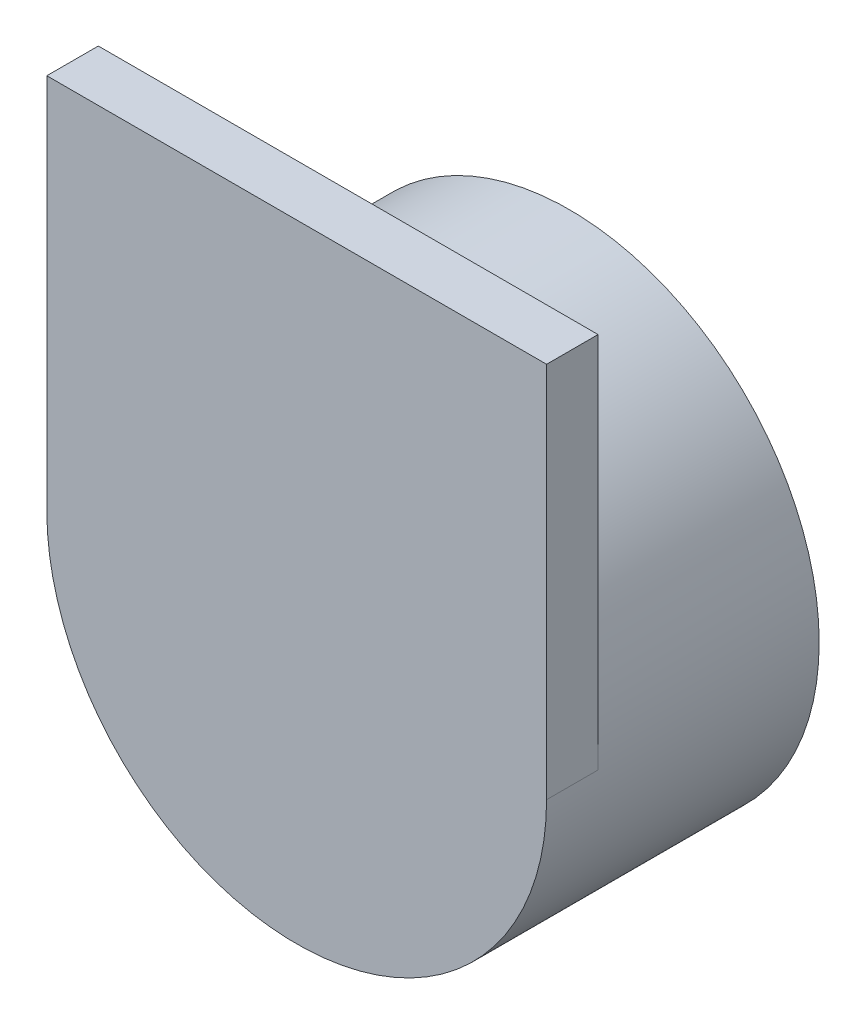
ISO-10303-21;
HEADER;
FILE_DESCRIPTION(('STEP AP214'),'2;1');
FILE_NAME('part.step','',(''),(''),'','','');
FILE_SCHEMA(('AUTOMOTIVE_DESIGN { 1 0 10303 214 1 1 1 1 }'));
ENDSEC;
DATA;
#1=APPLICATION_CONTEXT('core data for automotive mechanical design processes');
#2=APPLICATION_PROTOCOL_DEFINITION('international standard','automotive_design',2000,#1);
#3=PRODUCT_CONTEXT('',#1,'mechanical');
#4=PRODUCT('Part','Part','',(#3));
#5=PRODUCT_RELATED_PRODUCT_CATEGORY('part','',(#4));
#6=PRODUCT_DEFINITION_FORMATION('','',#4);
#7=PRODUCT_DEFINITION_CONTEXT('part definition',#1,'design');
#8=PRODUCT_DEFINITION('design','',#6,#7);
#9=PRODUCT_DEFINITION_SHAPE('','',#8);
#10=(LENGTH_UNIT() NAMED_UNIT(*) SI_UNIT(.MILLI.,.METRE.));
#11=(NAMED_UNIT(*) PLANE_ANGLE_UNIT() SI_UNIT($,.RADIAN.));
#12=(NAMED_UNIT(*) SI_UNIT($,.STERADIAN.) SOLID_ANGLE_UNIT());
#13=UNCERTAINTY_MEASURE_WITH_UNIT(LENGTH_MEASURE(1.E-05),#10,'distance_accuracy_value','');
#14=(GEOMETRIC_REPRESENTATION_CONTEXT(3) GLOBAL_UNCERTAINTY_ASSIGNED_CONTEXT((#13)) GLOBAL_UNIT_ASSIGNED_CONTEXT((#10,
#11,#12)) REPRESENTATION_CONTEXT('',''));
#15=CARTESIAN_POINT('',(0.,0.,0.));
#16=DIRECTION('',(0.,0.,1.));
#17=DIRECTION('',(1.,0.,0.));
#18=AXIS2_PLACEMENT_3D('',#15,#16,#17);
#19=CARTESIAN_POINT('',(0.,0.,9.));
#20=DIRECTION('',(0.,0.,-1.));
#21=DIRECTION('',(-1.,0.,0.));
#22=AXIS2_PLACEMENT_3D('',#19,#20,#21);
#23=CYLINDRICAL_SURFACE('',#22,8.25);
#24=CARTESIAN_POINT('',(0.,0.,9.));
#25=DIRECTION('',(0.,0.,1.));
#26=DIRECTION('',(1.,0.,0.));
#27=AXIS2_PLACEMENT_3D('',#24,#25,#26);
#28=CIRCLE('',#27,8.25);
#29=CARTESIAN_POINT('',(-8.25,0.,9.));
#30=VERTEX_POINT('',#29);
#31=CARTESIAN_POINT('',(8.25,0.,9.));
#32=VERTEX_POINT('',#31);
#33=EDGE_CURVE('E51',#30,#32,#28,.T.);
#34=ORIENTED_EDGE('',*,*,#33,.F.);
#35=DIRECTION('',(0.,0.,1.));
#36=VECTOR('',#35,1.);
#37=CARTESIAN_POINT('',(-8.25,0.,7.3));
#38=LINE('',#37,#36);
#39=CARTESIAN_POINT('',(-8.25,0.,7.3));
#40=VERTEX_POINT('',#39);
#41=EDGE_CURVE('E101',#40,#30,#38,.T.);
#42=ORIENTED_EDGE('',*,*,#41,.F.);
#43=CARTESIAN_POINT('',(0.,0.,7.3));
#44=DIRECTION('',(0.,0.,1.));
#45=DIRECTION('',(1.,0.,0.));
#46=AXIS2_PLACEMENT_3D('',#43,#44,#45);
#47=CIRCLE('',#46,8.25);
#48=CARTESIAN_POINT('',(8.25,0.,7.3));
#49=VERTEX_POINT('',#48);
#50=EDGE_CURVE('E11',#49,#40,#47,.T.);
#51=ORIENTED_EDGE('',*,*,#50,.F.);
#52=DIRECTION('',(0.,0.,1.));
#53=VECTOR('',#52,1.);
#54=CARTESIAN_POINT('',(8.25,0.,7.3));
#55=LINE('',#54,#53);
#56=EDGE_CURVE('E91',#49,#32,#55,.T.);
#57=ORIENTED_EDGE('',*,*,#56,.T.);
#58=EDGE_LOOP('',(#34,#42,#51,#57));
#59=FACE_BOUND('',#58,.T.);
#60=CARTESIAN_POINT('',(0.,0.,0.));
#61=DIRECTION('',(0.,0.,1.));
#62=DIRECTION('',(1.,0.,0.));
#63=AXIS2_PLACEMENT_3D('',#60,#61,#62);
#64=CIRCLE('',#63,8.25);
#65=CARTESIAN_POINT('',(8.25,0.,0.));
#66=VERTEX_POINT('',#65);
#67=EDGE_CURVE('E117',#66,#66,#64,.T.);
#68=ORIENTED_EDGE('',*,*,#67,.T.);
#69=EDGE_LOOP('',(#68));
#70=FACE_BOUND('',#69,.T.);
#71=ADVANCED_FACE('F43',(#59,#70),#23,.T.);
#72=CARTESIAN_POINT('',(0.,0.,9.));
#73=DIRECTION('',(0.,0.,1.));
#74=DIRECTION('',(1.,0.,0.));
#75=AXIS2_PLACEMENT_3D('',#72,#73,#74);
#76=PLANE('',#75);
#77=ORIENTED_EDGE('',*,*,#33,.T.);
#78=DIRECTION('',(0.,1.,0.));
#79=VECTOR('',#78,1.);
#80=CARTESIAN_POINT('',(8.25,12.45,9.));
#81=LINE('',#80,#79);
#82=CARTESIAN_POINT('',(8.25,12.45,9.));
#83=VERTEX_POINT('',#82);
#84=EDGE_CURVE('E96',#32,#83,#81,.T.);
#85=ORIENTED_EDGE('',*,*,#84,.T.);
#86=DIRECTION('',(-1.,0.,0.));
#87=VECTOR('',#86,1.);
#88=CARTESIAN_POINT('',(-8.25,12.45,9.));
#89=LINE('',#88,#87);
#90=CARTESIAN_POINT('',(-8.25,12.45,9.));
#91=VERTEX_POINT('',#90);
#92=EDGE_CURVE('E125',#83,#91,#89,.T.);
#93=ORIENTED_EDGE('',*,*,#92,.T.);
#94=DIRECTION('',(0.,-1.,0.));
#95=VECTOR('',#94,1.);
#96=CARTESIAN_POINT('',(-8.25,12.45,9.));
#97=LINE('',#96,#95);
#98=EDGE_CURVE('E58',#91,#30,#97,.T.);
#99=ORIENTED_EDGE('',*,*,#98,.T.);
#100=EDGE_LOOP('',(#77,#85,#93,#99));
#101=FACE_BOUND('',#100,.T.);
#102=ADVANCED_FACE('F135',(#101),#76,.T.);
#103=CARTESIAN_POINT('',(0.,0.,0.));
#104=DIRECTION('',(0.,0.,1.));
#105=DIRECTION('',(1.,0.,0.));
#106=AXIS2_PLACEMENT_3D('',#103,#104,#105);
#107=PLANE('',#106);
#108=ORIENTED_EDGE('',*,*,#67,.F.);
#109=EDGE_LOOP('',(#108));
#110=FACE_BOUND('',#109,.T.);
#111=ADVANCED_FACE('F137',(#110),#107,.F.);
#112=CARTESIAN_POINT('',(-8.25,12.45,7.3));
#113=DIRECTION('',(-1.,0.,0.));
#114=DIRECTION('',(0.,0.,1.));
#115=AXIS2_PLACEMENT_3D('',#112,#113,#114);
#116=PLANE('',#115);
#117=ORIENTED_EDGE('',*,*,#98,.F.);
#118=DIRECTION('',(0.,0.,1.));
#119=VECTOR('',#118,1.);
#120=CARTESIAN_POINT('',(-8.25,12.45,7.3));
#121=LINE('',#120,#119);
#122=CARTESIAN_POINT('',(-8.25,12.45,7.3));
#123=VERTEX_POINT('',#122);
#124=EDGE_CURVE('E66',#123,#91,#121,.T.);
#125=ORIENTED_EDGE('',*,*,#124,.F.);
#126=DIRECTION('',(0.,-1.,0.));
#127=VECTOR('',#126,1.);
#128=CARTESIAN_POINT('',(-8.25,12.45,7.3));
#129=LINE('',#128,#127);
#130=EDGE_CURVE('E106',#123,#40,#129,.T.);
#131=ORIENTED_EDGE('',*,*,#130,.T.);
#132=ORIENTED_EDGE('',*,*,#41,.T.);
#133=EDGE_LOOP('',(#117,#125,#131,#132));
#134=FACE_BOUND('',#133,.T.);
#135=ADVANCED_FACE('F133',(#134),#116,.T.);
#136=CARTESIAN_POINT('',(-8.25,12.45,7.3));
#137=DIRECTION('',(0.,1.,0.));
#138=DIRECTION('',(0.,0.,1.));
#139=AXIS2_PLACEMENT_3D('',#136,#137,#138);
#140=PLANE('',#139);
#141=ORIENTED_EDGE('',*,*,#92,.F.);
#142=DIRECTION('',(0.,0.,1.));
#143=VECTOR('',#142,1.);
#144=CARTESIAN_POINT('',(8.25,12.45,7.3));
#145=LINE('',#144,#143);
#146=CARTESIAN_POINT('',(8.25,12.45,7.3));
#147=VERTEX_POINT('',#146);
#148=EDGE_CURVE('E100',#147,#83,#145,.T.);
#149=ORIENTED_EDGE('',*,*,#148,.F.);
#150=DIRECTION('',(-1.,0.,0.));
#151=VECTOR('',#150,1.);
#152=CARTESIAN_POINT('',(-8.25,12.45,7.3));
#153=LINE('',#152,#151);
#154=EDGE_CURVE('E104',#147,#123,#153,.T.);
#155=ORIENTED_EDGE('',*,*,#154,.T.);
#156=ORIENTED_EDGE('',*,*,#124,.T.);
#157=EDGE_LOOP('',(#141,#149,#155,#156));
#158=FACE_BOUND('',#157,.T.);
#159=ADVANCED_FACE('F134',(#158),#140,.T.);
#160=CARTESIAN_POINT('',(8.25,12.45,7.3));
#161=DIRECTION('',(1.,0.,0.));
#162=DIRECTION('',(0.,1.,0.));
#163=AXIS2_PLACEMENT_3D('',#160,#161,#162);
#164=PLANE('',#163);
#165=ORIENTED_EDGE('',*,*,#84,.F.);
#166=ORIENTED_EDGE('',*,*,#56,.F.);
#167=DIRECTION('',(0.,1.,0.));
#168=VECTOR('',#167,1.);
#169=CARTESIAN_POINT('',(8.25,12.45,7.3));
#170=LINE('',#169,#168);
#171=EDGE_CURVE('E93',#49,#147,#170,.T.);
#172=ORIENTED_EDGE('',*,*,#171,.T.);
#173=ORIENTED_EDGE('',*,*,#148,.T.);
#174=EDGE_LOOP('',(#165,#166,#172,#173));
#175=FACE_BOUND('',#174,.T.);
#176=ADVANCED_FACE('F92',(#175),#164,.T.);
#177=CARTESIAN_POINT('',(0.,0.,7.3));
#178=DIRECTION('',(0.,0.,1.));
#179=DIRECTION('',(1.,0.,0.));
#180=AXIS2_PLACEMENT_3D('',#177,#178,#179);
#181=PLANE('',#180);
#182=ORIENTED_EDGE('',*,*,#171,.F.);
#183=ORIENTED_EDGE('',*,*,#50,.T.);
#184=ORIENTED_EDGE('',*,*,#130,.F.);
#185=ORIENTED_EDGE('',*,*,#154,.F.);
#186=EDGE_LOOP('',(#182,#183,#184,#185));
#187=FACE_BOUND('',#186,.T.);
#188=ADVANCED_FACE('F103',(#187),#181,.F.);
#189=CLOSED_SHELL('',(#71,#102,#111,#135,#159,#176,#188));
#190=MANIFOLD_SOLID_BREP('B2',#189);
#191=ADVANCED_BREP_SHAPE_REPRESENTATION('',(#18,#190),#14);
#192=SHAPE_DEFINITION_REPRESENTATION(#9,#191);
ENDSEC;
END-ISO-10303-21;
